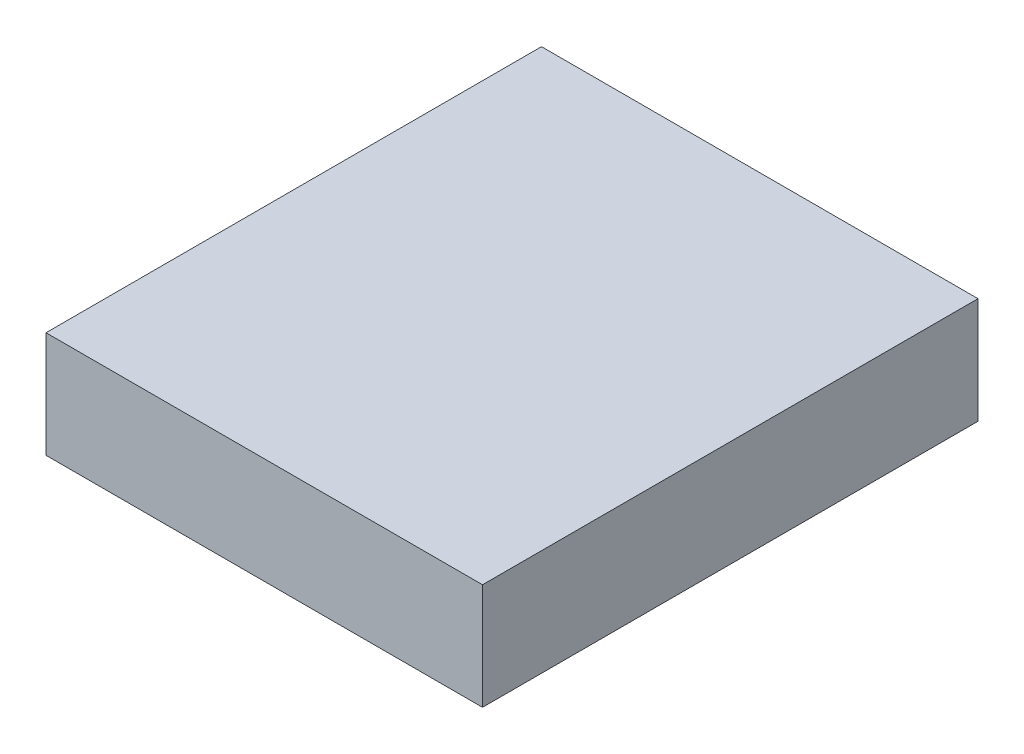
ISO-10303-21;
HEADER;
FILE_DESCRIPTION(('STEP AP214'),'2;1');
FILE_NAME('part.step','',(''),(''),'','','');
FILE_SCHEMA(('AUTOMOTIVE_DESIGN { 1 0 10303 214 1 1 1 1 }'));
ENDSEC;
DATA;
#1=APPLICATION_CONTEXT('core data for automotive mechanical design processes');
#2=APPLICATION_PROTOCOL_DEFINITION('international standard','automotive_design',2000,#1);
#3=PRODUCT_CONTEXT('',#1,'mechanical');
#4=PRODUCT('Part','Part','',(#3));
#5=PRODUCT_RELATED_PRODUCT_CATEGORY('part','',(#4));
#6=PRODUCT_DEFINITION_FORMATION('','',#4);
#7=PRODUCT_DEFINITION_CONTEXT('part definition',#1,'design');
#8=PRODUCT_DEFINITION('design','',#6,#7);
#9=PRODUCT_DEFINITION_SHAPE('','',#8);
#10=(LENGTH_UNIT() NAMED_UNIT(*) SI_UNIT(.MILLI.,.METRE.));
#11=(NAMED_UNIT(*) PLANE_ANGLE_UNIT() SI_UNIT($,.RADIAN.));
#12=(NAMED_UNIT(*) SI_UNIT($,.STERADIAN.) SOLID_ANGLE_UNIT());
#13=UNCERTAINTY_MEASURE_WITH_UNIT(LENGTH_MEASURE(1.E-05),#10,'distance_accuracy_value','');
#14=(GEOMETRIC_REPRESENTATION_CONTEXT(3) GLOBAL_UNCERTAINTY_ASSIGNED_CONTEXT((#13)) GLOBAL_UNIT_ASSIGNED_CONTEXT((#10,
#11,#12)) REPRESENTATION_CONTEXT('',''));
#15=CARTESIAN_POINT('',(0.,0.,0.));
#16=DIRECTION('',(0.,0.,1.));
#17=DIRECTION('',(1.,0.,0.));
#18=AXIS2_PLACEMENT_3D('',#15,#16,#17);
#19=CARTESIAN_POINT('',(18.5,9.,21.));
#20=DIRECTION('',(-1.,0.,0.));
#21=DIRECTION('',(0.,0.,1.));
#22=AXIS2_PLACEMENT_3D('',#19,#20,#21);
#23=PLANE('',#22);
#24=DIRECTION('',(0.,0.,-1.));
#25=VECTOR('',#24,1.);
#26=CARTESIAN_POINT('',(18.5,0.,21.));
#27=LINE('',#26,#25);
#28=CARTESIAN_POINT('',(18.5,0.,21.));
#29=VERTEX_POINT('',#28);
#30=CARTESIAN_POINT('',(18.5,0.,-21.));
#31=VERTEX_POINT('',#30);
#32=EDGE_CURVE('E109',#29,#31,#27,.T.);
#33=ORIENTED_EDGE('',*,*,#32,.T.);
#34=DIRECTION('',(0.,-1.,0.));
#35=VECTOR('',#34,1.);
#36=CARTESIAN_POINT('',(18.5,9.,-21.));
#37=LINE('',#36,#35);
#38=CARTESIAN_POINT('',(18.5,9.,-21.));
#39=VERTEX_POINT('',#38);
#40=EDGE_CURVE('E11',#39,#31,#37,.T.);
#41=ORIENTED_EDGE('',*,*,#40,.F.);
#42=DIRECTION('',(0.,0.,-1.));
#43=VECTOR('',#42,1.);
#44=CARTESIAN_POINT('',(18.5,9.,21.));
#45=LINE('',#44,#43);
#46=CARTESIAN_POINT('',(18.5,9.,21.));
#47=VERTEX_POINT('',#46);
#48=EDGE_CURVE('E93',#47,#39,#45,.T.);
#49=ORIENTED_EDGE('',*,*,#48,.F.);
#50=DIRECTION('',(0.,-1.,0.));
#51=VECTOR('',#50,1.);
#52=CARTESIAN_POINT('',(18.5,9.,21.));
#53=LINE('',#52,#51);
#54=EDGE_CURVE('E105',#47,#29,#53,.T.);
#55=ORIENTED_EDGE('',*,*,#54,.T.);
#56=EDGE_LOOP('',(#33,#41,#49,#55));
#57=FACE_BOUND('',#56,.T.);
#58=ADVANCED_FACE('F41',(#57),#23,.F.);
#59=CARTESIAN_POINT('',(-18.5,9.,-21.));
#60=DIRECTION('',(0.,0.,1.));
#61=DIRECTION('',(1.,0.,0.));
#62=AXIS2_PLACEMENT_3D('',#59,#60,#61);
#63=PLANE('',#62);
#64=DIRECTION('',(-1.,0.,0.));
#65=VECTOR('',#64,1.);
#66=CARTESIAN_POINT('',(-18.5,0.,-21.));
#67=LINE('',#66,#65);
#68=CARTESIAN_POINT('',(-18.5,0.,-21.));
#69=VERTEX_POINT('',#68);
#70=EDGE_CURVE('E98',#31,#69,#67,.T.);
#71=ORIENTED_EDGE('',*,*,#70,.T.);
#72=DIRECTION('',(0.,-1.,0.));
#73=VECTOR('',#72,1.);
#74=CARTESIAN_POINT('',(-18.5,9.,-21.));
#75=LINE('',#74,#73);
#76=CARTESIAN_POINT('',(-18.5,9.,-21.));
#77=VERTEX_POINT('',#76);
#78=EDGE_CURVE('E50',#77,#69,#75,.T.);
#79=ORIENTED_EDGE('',*,*,#78,.F.);
#80=DIRECTION('',(-1.,0.,0.));
#81=VECTOR('',#80,1.);
#82=CARTESIAN_POINT('',(-18.5,9.,-21.));
#83=LINE('',#82,#81);
#84=EDGE_CURVE('E88',#39,#77,#83,.T.);
#85=ORIENTED_EDGE('',*,*,#84,.F.);
#86=ORIENTED_EDGE('',*,*,#40,.T.);
#87=EDGE_LOOP('',(#71,#79,#85,#86));
#88=FACE_BOUND('',#87,.T.);
#89=ADVANCED_FACE('F97',(#88),#63,.F.);
#90=CARTESIAN_POINT('',(-18.5,9.,21.));
#91=DIRECTION('',(1.,0.,0.));
#92=DIRECTION('',(0.,0.,-1.));
#93=AXIS2_PLACEMENT_3D('',#90,#91,#92);
#94=PLANE('',#93);
#95=DIRECTION('',(0.,0.,1.));
#96=VECTOR('',#95,1.);
#97=CARTESIAN_POINT('',(-18.5,0.,21.));
#98=LINE('',#97,#96);
#99=CARTESIAN_POINT('',(-18.5,0.,21.));
#100=VERTEX_POINT('',#99);
#101=EDGE_CURVE('E75',#69,#100,#98,.T.);
#102=ORIENTED_EDGE('',*,*,#101,.T.);
#103=DIRECTION('',(0.,-1.,0.));
#104=VECTOR('',#103,1.);
#105=CARTESIAN_POINT('',(-18.5,9.,21.));
#106=LINE('',#105,#104);
#107=CARTESIAN_POINT('',(-18.5,9.,21.));
#108=VERTEX_POINT('',#107);
#109=EDGE_CURVE('E100',#108,#100,#106,.T.);
#110=ORIENTED_EDGE('',*,*,#109,.F.);
#111=DIRECTION('',(0.,0.,1.));
#112=VECTOR('',#111,1.);
#113=CARTESIAN_POINT('',(-18.5,9.,21.));
#114=LINE('',#113,#112);
#115=EDGE_CURVE('E91',#77,#108,#114,.T.);
#116=ORIENTED_EDGE('',*,*,#115,.F.);
#117=ORIENTED_EDGE('',*,*,#78,.T.);
#118=EDGE_LOOP('',(#102,#110,#116,#117));
#119=FACE_BOUND('',#118,.T.);
#120=ADVANCED_FACE('F101',(#119),#94,.F.);
#121=CARTESIAN_POINT('',(-18.5,9.,21.));
#122=DIRECTION('',(0.,0.,-1.));
#123=DIRECTION('',(-1.,0.,0.));
#124=AXIS2_PLACEMENT_3D('',#121,#122,#123);
#125=PLANE('',#124);
#126=DIRECTION('',(1.,0.,0.));
#127=VECTOR('',#126,1.);
#128=CARTESIAN_POINT('',(-18.5,0.,21.));
#129=LINE('',#128,#127);
#130=EDGE_CURVE('E81',#100,#29,#129,.T.);
#131=ORIENTED_EDGE('',*,*,#130,.T.);
#132=ORIENTED_EDGE('',*,*,#54,.F.);
#133=DIRECTION('',(1.,0.,0.));
#134=VECTOR('',#133,1.);
#135=CARTESIAN_POINT('',(-18.5,9.,21.));
#136=LINE('',#135,#134);
#137=EDGE_CURVE('E58',#108,#47,#136,.T.);
#138=ORIENTED_EDGE('',*,*,#137,.F.);
#139=ORIENTED_EDGE('',*,*,#109,.T.);
#140=EDGE_LOOP('',(#131,#132,#138,#139));
#141=FACE_BOUND('',#140,.T.);
#142=ADVANCED_FACE('F122',(#141),#125,.F.);
#143=CARTESIAN_POINT('',(0.,9.,0.));
#144=DIRECTION('',(0.,-1.,0.));
#145=DIRECTION('',(0.,0.,-1.));
#146=AXIS2_PLACEMENT_3D('',#143,#144,#145);
#147=PLANE('',#146);
#148=ORIENTED_EDGE('',*,*,#48,.T.);
#149=ORIENTED_EDGE('',*,*,#84,.T.);
#150=ORIENTED_EDGE('',*,*,#115,.T.);
#151=ORIENTED_EDGE('',*,*,#137,.T.);
#152=EDGE_LOOP('',(#148,#149,#150,#151));
#153=FACE_BOUND('',#152,.T.);
#154=ADVANCED_FACE('F89',(#153),#147,.F.);
#155=CARTESIAN_POINT('',(0.,0.,0.));
#156=DIRECTION('',(0.,-1.,0.));
#157=DIRECTION('',(0.,0.,-1.));
#158=AXIS2_PLACEMENT_3D('',#155,#156,#157);
#159=PLANE('',#158);
#160=ORIENTED_EDGE('',*,*,#32,.F.);
#161=ORIENTED_EDGE('',*,*,#130,.F.);
#162=ORIENTED_EDGE('',*,*,#101,.F.);
#163=ORIENTED_EDGE('',*,*,#70,.F.);
#164=EDGE_LOOP('',(#160,#161,#162,#163));
#165=FACE_BOUND('',#164,.T.);
#166=ADVANCED_FACE('F125',(#165),#159,.T.);
#167=CLOSED_SHELL('',(#58,#89,#120,#142,#154,#166));
#168=MANIFOLD_SOLID_BREP('B2',#167);
#169=ADVANCED_BREP_SHAPE_REPRESENTATION('',(#18,#168),#14);
#170=SHAPE_DEFINITION_REPRESENTATION(#9,#169);
ENDSEC;
END-ISO-10303-21;
